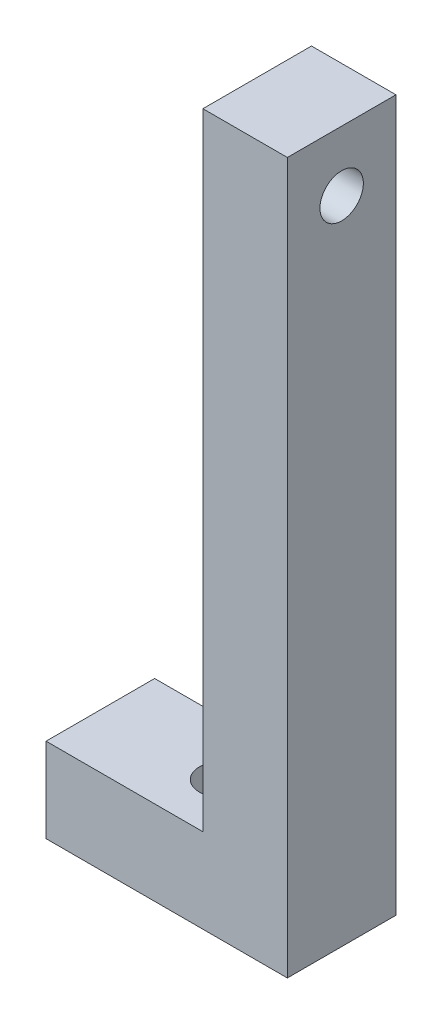
ISO-10303-21;
HEADER;
FILE_DESCRIPTION(('STEP AP214'),'2;1');
FILE_NAME('part.step','',(''),(''),'','','');
FILE_SCHEMA(('AUTOMOTIVE_DESIGN { 1 0 10303 214 1 1 1 1 }'));
ENDSEC;
DATA;
#1=APPLICATION_CONTEXT('core data for automotive mechanical design processes');
#2=APPLICATION_PROTOCOL_DEFINITION('international standard','automotive_design',2000,#1);
#3=PRODUCT_CONTEXT('',#1,'mechanical');
#4=PRODUCT('Part','Part','',(#3));
#5=PRODUCT_RELATED_PRODUCT_CATEGORY('part','',(#4));
#6=PRODUCT_DEFINITION_FORMATION('','',#4);
#7=PRODUCT_DEFINITION_CONTEXT('part definition',#1,'design');
#8=PRODUCT_DEFINITION('design','',#6,#7);
#9=PRODUCT_DEFINITION_SHAPE('','',#8);
#10=(LENGTH_UNIT() NAMED_UNIT(*) SI_UNIT(.MILLI.,.METRE.));
#11=(NAMED_UNIT(*) PLANE_ANGLE_UNIT() SI_UNIT($,.RADIAN.));
#12=(NAMED_UNIT(*) SI_UNIT($,.STERADIAN.) SOLID_ANGLE_UNIT());
#13=UNCERTAINTY_MEASURE_WITH_UNIT(LENGTH_MEASURE(1.E-05),#10,'distance_accuracy_value','');
#14=(GEOMETRIC_REPRESENTATION_CONTEXT(3) GLOBAL_UNCERTAINTY_ASSIGNED_CONTEXT((#13)) GLOBAL_UNIT_ASSIGNED_CONTEXT((#10,
#11,#12)) REPRESENTATION_CONTEXT('',''));
#15=CARTESIAN_POINT('',(0.,0.,0.));
#16=DIRECTION('',(0.,0.,1.));
#17=DIRECTION('',(1.,0.,0.));
#18=AXIS2_PLACEMENT_3D('',#15,#16,#17);
#19=CARTESIAN_POINT('',(0.,7.,9.));
#20=DIRECTION('',(0.,1.,0.));
#21=DIRECTION('',(0.,0.,1.));
#22=AXIS2_PLACEMENT_3D('',#19,#20,#21);
#23=PLANE('',#22);
#24=CARTESIAN_POINT('',(10.,7.,4.5));
#25=DIRECTION('',(0.,1.,0.));
#26=DIRECTION('',(0.,0.,1.));
#27=AXIS2_PLACEMENT_3D('',#24,#25,#26);
#28=CIRCLE('',#27,1.8);
#29=CARTESIAN_POINT('',(10.,7.,6.3));
#30=VERTEX_POINT('',#29);
#31=EDGE_CURVE('E189',#30,#30,#28,.T.);
#32=ORIENTED_EDGE('',*,*,#31,.F.);
#33=EDGE_LOOP('',(#32));
#34=FACE_BOUND('',#33,.T.);
#35=DIRECTION('',(1.,0.,0.));
#36=VECTOR('',#35,1.);
#37=CARTESIAN_POINT('',(0.,7.,0.));
#38=LINE('',#37,#36);
#39=CARTESIAN_POINT('',(0.,7.,0.));
#40=VERTEX_POINT('',#39);
#41=CARTESIAN_POINT('',(13.,7.,0.));
#42=VERTEX_POINT('',#41);
#43=EDGE_CURVE('E133',#40,#42,#38,.T.);
#44=ORIENTED_EDGE('',*,*,#43,.F.);
#45=DIRECTION('',(0.,0.,-1.));
#46=VECTOR('',#45,1.);
#47=CARTESIAN_POINT('',(0.,7.,9.));
#48=LINE('',#47,#46);
#49=CARTESIAN_POINT('',(0.,7.,9.));
#50=VERTEX_POINT('',#49);
#51=EDGE_CURVE('E11',#50,#40,#48,.T.);
#52=ORIENTED_EDGE('',*,*,#51,.F.);
#53=DIRECTION('',(1.,0.,0.));
#54=VECTOR('',#53,1.);
#55=CARTESIAN_POINT('',(0.,7.,9.));
#56=LINE('',#55,#54);
#57=CARTESIAN_POINT('',(13.,7.,9.));
#58=VERTEX_POINT('',#57);
#59=EDGE_CURVE('E152',#50,#58,#56,.T.);
#60=ORIENTED_EDGE('',*,*,#59,.T.);
#61=DIRECTION('',(0.,0.,-1.));
#62=VECTOR('',#61,1.);
#63=CARTESIAN_POINT('',(13.,7.,9.));
#64=LINE('',#63,#62);
#65=EDGE_CURVE('E63',#58,#42,#64,.T.);
#66=ORIENTED_EDGE('',*,*,#65,.T.);
#67=EDGE_LOOP('',(#44,#52,#60,#66));
#68=FACE_BOUND('',#67,.T.);
#69=ADVANCED_FACE('F45',(#34,#68),#23,.T.);
#70=CARTESIAN_POINT('',(0.,0.,9.));
#71=DIRECTION('',(-1.,0.,0.));
#72=DIRECTION('',(0.,-1.,0.));
#73=AXIS2_PLACEMENT_3D('',#70,#71,#72);
#74=PLANE('',#73);
#75=DIRECTION('',(0.,1.,0.));
#76=VECTOR('',#75,1.);
#77=CARTESIAN_POINT('',(0.,0.,0.));
#78=LINE('',#77,#76);
#79=CARTESIAN_POINT('',(0.,0.,0.));
#80=VERTEX_POINT('',#79);
#81=EDGE_CURVE('E136',#80,#40,#78,.T.);
#82=ORIENTED_EDGE('',*,*,#81,.F.);
#83=DIRECTION('',(0.,0.,-1.));
#84=VECTOR('',#83,1.);
#85=CARTESIAN_POINT('',(0.,0.,9.));
#86=LINE('',#85,#84);
#87=CARTESIAN_POINT('',(0.,0.,9.));
#88=VERTEX_POINT('',#87);
#89=EDGE_CURVE('E55',#88,#80,#86,.T.);
#90=ORIENTED_EDGE('',*,*,#89,.F.);
#91=DIRECTION('',(0.,1.,0.));
#92=VECTOR('',#91,1.);
#93=CARTESIAN_POINT('',(0.,0.,9.));
#94=LINE('',#93,#92);
#95=EDGE_CURVE('E169',#88,#50,#94,.T.);
#96=ORIENTED_EDGE('',*,*,#95,.T.);
#97=ORIENTED_EDGE('',*,*,#51,.T.);
#98=EDGE_LOOP('',(#82,#90,#96,#97));
#99=FACE_BOUND('',#98,.T.);
#100=ADVANCED_FACE('F168',(#99),#74,.T.);
#101=CARTESIAN_POINT('',(0.,0.,9.));
#102=DIRECTION('',(0.,1.,0.));
#103=DIRECTION('',(0.,0.,1.));
#104=AXIS2_PLACEMENT_3D('',#101,#102,#103);
#105=PLANE('',#104);
#106=CARTESIAN_POINT('',(10.,0.,4.5));
#107=DIRECTION('',(0.,1.,0.));
#108=DIRECTION('',(0.,0.,1.));
#109=AXIS2_PLACEMENT_3D('',#106,#107,#108);
#110=CIRCLE('',#109,1.8);
#111=CARTESIAN_POINT('',(10.,0.,6.3));
#112=VERTEX_POINT('',#111);
#113=EDGE_CURVE('E48',#112,#112,#110,.T.);
#114=ORIENTED_EDGE('',*,*,#113,.T.);
#115=EDGE_LOOP('',(#114));
#116=FACE_BOUND('',#115,.T.);
#117=DIRECTION('',(1.,0.,0.));
#118=VECTOR('',#117,1.);
#119=CARTESIAN_POINT('',(0.,0.,0.));
#120=LINE('',#119,#118);
#121=CARTESIAN_POINT('',(20.,0.,0.));
#122=VERTEX_POINT('',#121);
#123=EDGE_CURVE('E140',#80,#122,#120,.T.);
#124=ORIENTED_EDGE('',*,*,#123,.T.);
#125=DIRECTION('',(0.,0.,-1.));
#126=VECTOR('',#125,1.);
#127=CARTESIAN_POINT('',(20.,0.,9.));
#128=LINE('',#127,#126);
#129=CARTESIAN_POINT('',(20.,0.,9.));
#130=VERTEX_POINT('',#129);
#131=EDGE_CURVE('E123',#130,#122,#128,.T.);
#132=ORIENTED_EDGE('',*,*,#131,.F.);
#133=DIRECTION('',(1.,0.,0.));
#134=VECTOR('',#133,1.);
#135=CARTESIAN_POINT('',(0.,0.,9.));
#136=LINE('',#135,#134);
#137=EDGE_CURVE('E109',#88,#130,#136,.T.);
#138=ORIENTED_EDGE('',*,*,#137,.F.);
#139=ORIENTED_EDGE('',*,*,#89,.T.);
#140=EDGE_LOOP('',(#124,#132,#138,#139));
#141=FACE_BOUND('',#140,.T.);
#142=ADVANCED_FACE('F162',(#116,#141),#105,.F.);
#143=CARTESIAN_POINT('',(20.,0.,9.));
#144=DIRECTION('',(-1.,0.,0.));
#145=DIRECTION('',(0.,0.,1.));
#146=AXIS2_PLACEMENT_3D('',#143,#144,#145);
#147=PLANE('',#146);
#148=CARTESIAN_POINT('',(20.,53.9,4.5));
#149=DIRECTION('',(-1.,0.,0.));
#150=DIRECTION('',(0.,0.,1.));
#151=AXIS2_PLACEMENT_3D('',#148,#149,#150);
#152=CIRCLE('',#151,1.8);
#153=CARTESIAN_POINT('',(20.,53.9,6.3));
#154=VERTEX_POINT('',#153);
#155=EDGE_CURVE('E192',#154,#154,#152,.T.);
#156=ORIENTED_EDGE('',*,*,#155,.T.);
#157=EDGE_LOOP('',(#156));
#158=FACE_BOUND('',#157,.T.);
#159=DIRECTION('',(0.,1.,0.));
#160=VECTOR('',#159,1.);
#161=CARTESIAN_POINT('',(20.,0.,0.));
#162=LINE('',#161,#160);
#163=CARTESIAN_POINT('',(20.,58.9,0.));
#164=VERTEX_POINT('',#163);
#165=EDGE_CURVE('E119',#122,#164,#162,.T.);
#166=ORIENTED_EDGE('',*,*,#165,.T.);
#167=DIRECTION('',(0.,0.,-1.));
#168=VECTOR('',#167,1.);
#169=CARTESIAN_POINT('',(20.,58.9,9.));
#170=LINE('',#169,#168);
#171=CARTESIAN_POINT('',(20.,58.9,9.));
#172=VERTEX_POINT('',#171);
#173=EDGE_CURVE('E116',#172,#164,#170,.T.);
#174=ORIENTED_EDGE('',*,*,#173,.F.);
#175=DIRECTION('',(0.,1.,0.));
#176=VECTOR('',#175,1.);
#177=CARTESIAN_POINT('',(20.,0.,9.));
#178=LINE('',#177,#176);
#179=EDGE_CURVE('E101',#130,#172,#178,.T.);
#180=ORIENTED_EDGE('',*,*,#179,.F.);
#181=ORIENTED_EDGE('',*,*,#131,.T.);
#182=EDGE_LOOP('',(#166,#174,#180,#181));
#183=FACE_BOUND('',#182,.T.);
#184=ADVANCED_FACE('F117',(#158,#183),#147,.F.);
#185=CARTESIAN_POINT('',(0.,58.9,9.));
#186=DIRECTION('',(0.,-1.,0.));
#187=DIRECTION('',(0.,0.,-1.));
#188=AXIS2_PLACEMENT_3D('',#185,#186,#187);
#189=PLANE('',#188);
#190=DIRECTION('',(-1.,0.,0.));
#191=VECTOR('',#190,1.);
#192=CARTESIAN_POINT('',(0.,58.9,0.));
#193=LINE('',#192,#191);
#194=CARTESIAN_POINT('',(13.,58.9,0.));
#195=VERTEX_POINT('',#194);
#196=EDGE_CURVE('E145',#164,#195,#193,.T.);
#197=ORIENTED_EDGE('',*,*,#196,.T.);
#198=DIRECTION('',(0.,0.,-1.));
#199=VECTOR('',#198,1.);
#200=CARTESIAN_POINT('',(13.,58.9,9.));
#201=LINE('',#200,#199);
#202=CARTESIAN_POINT('',(13.,58.9,9.));
#203=VERTEX_POINT('',#202);
#204=EDGE_CURVE('E83',#203,#195,#201,.T.);
#205=ORIENTED_EDGE('',*,*,#204,.F.);
#206=DIRECTION('',(-1.,0.,0.));
#207=VECTOR('',#206,1.);
#208=CARTESIAN_POINT('',(0.,58.9,9.));
#209=LINE('',#208,#207);
#210=EDGE_CURVE('E106',#172,#203,#209,.T.);
#211=ORIENTED_EDGE('',*,*,#210,.F.);
#212=ORIENTED_EDGE('',*,*,#173,.T.);
#213=EDGE_LOOP('',(#197,#205,#211,#212));
#214=FACE_BOUND('',#213,.T.);
#215=ADVANCED_FACE('F125',(#214),#189,.F.);
#216=CARTESIAN_POINT('',(13.,0.,9.));
#217=DIRECTION('',(-1.,0.,0.));
#218=DIRECTION('',(0.,-1.,0.));
#219=AXIS2_PLACEMENT_3D('',#216,#217,#218);
#220=PLANE('',#219);
#221=CARTESIAN_POINT('',(13.,53.9,4.5));
#222=DIRECTION('',(-1.,0.,0.));
#223=DIRECTION('',(0.,-1.,0.));
#224=AXIS2_PLACEMENT_3D('',#221,#222,#223);
#225=CIRCLE('',#224,1.8);
#226=CARTESIAN_POINT('',(13.,52.1,4.5));
#227=VERTEX_POINT('',#226);
#228=EDGE_CURVE('E198',#227,#227,#225,.T.);
#229=ORIENTED_EDGE('',*,*,#228,.F.);
#230=EDGE_LOOP('',(#229));
#231=FACE_BOUND('',#230,.T.);
#232=DIRECTION('',(0.,1.,0.));
#233=VECTOR('',#232,1.);
#234=CARTESIAN_POINT('',(13.,0.,0.));
#235=LINE('',#234,#233);
#236=EDGE_CURVE('E148',#42,#195,#235,.T.);
#237=ORIENTED_EDGE('',*,*,#236,.F.);
#238=ORIENTED_EDGE('',*,*,#65,.F.);
#239=DIRECTION('',(0.,1.,0.));
#240=VECTOR('',#239,1.);
#241=CARTESIAN_POINT('',(13.,0.,9.));
#242=LINE('',#241,#240);
#243=EDGE_CURVE('E127',#58,#203,#242,.T.);
#244=ORIENTED_EDGE('',*,*,#243,.T.);
#245=ORIENTED_EDGE('',*,*,#204,.T.);
#246=EDGE_LOOP('',(#237,#238,#244,#245));
#247=FACE_BOUND('',#246,.T.);
#248=ADVANCED_FACE('F170',(#231,#247),#220,.T.);
#249=CARTESIAN_POINT('',(0.,0.,9.));
#250=DIRECTION('',(0.,0.,1.));
#251=DIRECTION('',(1.,0.,0.));
#252=AXIS2_PLACEMENT_3D('',#249,#250,#251);
#253=PLANE('',#252);
#254=ORIENTED_EDGE('',*,*,#59,.F.);
#255=ORIENTED_EDGE('',*,*,#95,.F.);
#256=ORIENTED_EDGE('',*,*,#137,.T.);
#257=ORIENTED_EDGE('',*,*,#179,.T.);
#258=ORIENTED_EDGE('',*,*,#210,.T.);
#259=ORIENTED_EDGE('',*,*,#243,.F.);
#260=EDGE_LOOP('',(#254,#255,#256,#257,#258,#259));
#261=FACE_BOUND('',#260,.T.);
#262=ADVANCED_FACE('F103',(#261),#253,.T.);
#263=CARTESIAN_POINT('',(0.,0.,0.));
#264=DIRECTION('',(0.,0.,1.));
#265=DIRECTION('',(1.,0.,0.));
#266=AXIS2_PLACEMENT_3D('',#263,#264,#265);
#267=PLANE('',#266);
#268=ORIENTED_EDGE('',*,*,#43,.T.);
#269=ORIENTED_EDGE('',*,*,#236,.T.);
#270=ORIENTED_EDGE('',*,*,#196,.F.);
#271=ORIENTED_EDGE('',*,*,#165,.F.);
#272=ORIENTED_EDGE('',*,*,#123,.F.);
#273=ORIENTED_EDGE('',*,*,#81,.T.);
#274=EDGE_LOOP('',(#268,#269,#270,#271,#272,#273));
#275=FACE_BOUND('',#274,.T.);
#276=ADVANCED_FACE('F167',(#275),#267,.F.);
#277=CARTESIAN_POINT('',(10.,-2.,4.5));
#278=DIRECTION('',(0.,1.,0.));
#279=DIRECTION('',(0.,0.,1.));
#280=AXIS2_PLACEMENT_3D('',#277,#278,#279);
#281=CYLINDRICAL_SURFACE('',#280,1.8);
#282=ORIENTED_EDGE('',*,*,#31,.T.);
#283=EDGE_LOOP('',(#282));
#284=FACE_BOUND('',#283,.T.);
#285=ORIENTED_EDGE('',*,*,#113,.F.);
#286=EDGE_LOOP('',(#285));
#287=FACE_BOUND('',#286,.T.);
#288=ADVANCED_FACE('F212',(#284,#287),#281,.F.);
#289=CARTESIAN_POINT('',(22.,53.9,4.5));
#290=DIRECTION('',(-1.,0.,0.));
#291=DIRECTION('',(0.,-1.,0.));
#292=AXIS2_PLACEMENT_3D('',#289,#290,#291);
#293=CYLINDRICAL_SURFACE('',#292,1.8);
#294=ORIENTED_EDGE('',*,*,#228,.T.);
#295=EDGE_LOOP('',(#294));
#296=FACE_BOUND('',#295,.T.);
#297=ORIENTED_EDGE('',*,*,#155,.F.);
#298=EDGE_LOOP('',(#297));
#299=FACE_BOUND('',#298,.T.);
#300=ADVANCED_FACE('F209',(#296,#299),#293,.F.);
#301=CLOSED_SHELL('',(#69,#100,#142,#184,#215,#248,#262,#276,#288,#300));
#302=MANIFOLD_SOLID_BREP('B2',#301);
#303=ADVANCED_BREP_SHAPE_REPRESENTATION('',(#18,#302),#14);
#304=SHAPE_DEFINITION_REPRESENTATION(#9,#303);
ENDSEC;
END-ISO-10303-21;
